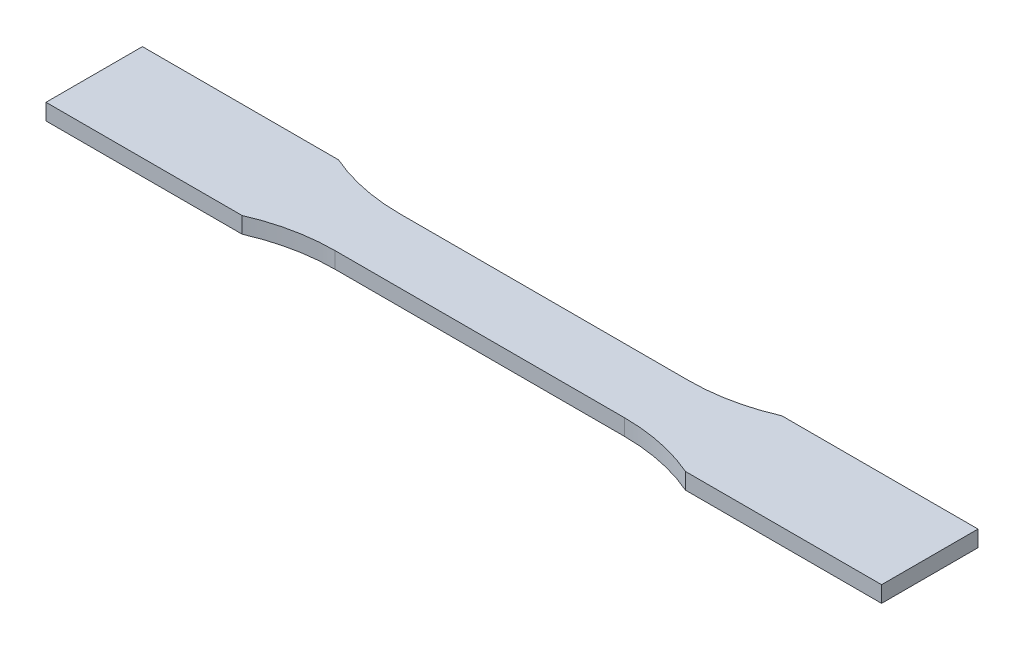
ISO-10303-21;
HEADER;
FILE_DESCRIPTION(('STEP AP214'),'2;1');
FILE_NAME('part.step','',(''),(''),'','','');
FILE_SCHEMA(('AUTOMOTIVE_DESIGN { 1 0 10303 214 1 1 1 1 }'));
ENDSEC;
DATA;
#1=APPLICATION_CONTEXT('core data for automotive mechanical design processes');
#2=APPLICATION_PROTOCOL_DEFINITION('international standard','automotive_design',2000,#1);
#3=PRODUCT_CONTEXT('',#1,'mechanical');
#4=PRODUCT('Part','Part','',(#3));
#5=PRODUCT_RELATED_PRODUCT_CATEGORY('part','',(#4));
#6=PRODUCT_DEFINITION_FORMATION('','',#4);
#7=PRODUCT_DEFINITION_CONTEXT('part definition',#1,'design');
#8=PRODUCT_DEFINITION('design','',#6,#7);
#9=PRODUCT_DEFINITION_SHAPE('','',#8);
#10=(LENGTH_UNIT() NAMED_UNIT(*) SI_UNIT(.MILLI.,.METRE.));
#11=(NAMED_UNIT(*) PLANE_ANGLE_UNIT() SI_UNIT($,.RADIAN.));
#12=(NAMED_UNIT(*) SI_UNIT($,.STERADIAN.) SOLID_ANGLE_UNIT());
#13=UNCERTAINTY_MEASURE_WITH_UNIT(LENGTH_MEASURE(1.E-05),#10,'distance_accuracy_value','');
#14=(GEOMETRIC_REPRESENTATION_CONTEXT(3) GLOBAL_UNCERTAINTY_ASSIGNED_CONTEXT((#13)) GLOBAL_UNIT_ASSIGNED_CONTEXT((#10,
#11,#12)) REPRESENTATION_CONTEXT('',''));
#15=CARTESIAN_POINT('',(0.,0.,0.));
#16=DIRECTION('',(0.,0.,1.));
#17=DIRECTION('',(1.,0.,0.));
#18=AXIS2_PLACEMENT_3D('',#15,#16,#17);
#19=CARTESIAN_POINT('',(-28.575,3.2,-44.45));
#20=DIRECTION('',(0.,-1.,0.));
#21=DIRECTION('',(0.,0.,-1.));
#22=AXIS2_PLACEMENT_3D('',#19,#20,#21);
#23=CYLINDRICAL_SURFACE('',#22,38.1);
#24=CARTESIAN_POINT('',(-28.575,0.,-44.45));
#25=DIRECTION('',(0.,1.,0.));
#26=DIRECTION('',(0.,0.,1.));
#27=AXIS2_PLACEMENT_3D('',#24,#25,#26);
#28=CIRCLE('',#27,38.1);
#29=CARTESIAN_POINT('',(-43.8017650865179,0.,-9.525));
#30=VERTEX_POINT('',#29);
#31=CARTESIAN_POINT('',(-28.575,0.,-6.35));
#32=VERTEX_POINT('',#31);
#33=EDGE_CURVE('E151',#30,#32,#28,.T.);
#34=ORIENTED_EDGE('',*,*,#33,.F.);
#35=DIRECTION('',(0.,-1.,0.));
#36=VECTOR('',#35,1.);
#37=CARTESIAN_POINT('',(-43.8017650865179,3.2,-9.525));
#38=LINE('',#37,#36);
#39=CARTESIAN_POINT('',(-43.8017650865179,3.2,-9.525));
#40=VERTEX_POINT('',#39);
#41=EDGE_CURVE('E11',#40,#30,#38,.T.);
#42=ORIENTED_EDGE('',*,*,#41,.F.);
#43=CARTESIAN_POINT('',(-28.575,3.2,-44.45));
#44=DIRECTION('',(0.,1.,0.));
#45=DIRECTION('',(0.,0.,1.));
#46=AXIS2_PLACEMENT_3D('',#43,#44,#45);
#47=CIRCLE('',#46,38.1);
#48=CARTESIAN_POINT('',(-28.575,3.2,-6.35));
#49=VERTEX_POINT('',#48);
#50=EDGE_CURVE('E182',#40,#49,#47,.T.);
#51=ORIENTED_EDGE('',*,*,#50,.T.);
#52=DIRECTION('',(0.,-1.,0.));
#53=VECTOR('',#52,1.);
#54=CARTESIAN_POINT('',(-28.575,3.2,-6.35));
#55=LINE('',#54,#53);
#56=EDGE_CURVE('E51',#49,#32,#55,.T.);
#57=ORIENTED_EDGE('',*,*,#56,.T.);
#58=EDGE_LOOP('',(#34,#42,#51,#57));
#59=FACE_BOUND('',#58,.T.);
#60=ADVANCED_FACE('F35',(#59),#23,.F.);
#61=CARTESIAN_POINT('',(0.,3.2,-9.525));
#62=DIRECTION('',(0.,0.,-1.));
#63=DIRECTION('',(-1.,0.,0.));
#64=AXIS2_PLACEMENT_3D('',#61,#62,#63);
#65=PLANE('',#64);
#66=DIRECTION('',(1.,0.,0.));
#67=VECTOR('',#66,1.);
#68=CARTESIAN_POINT('',(0.,0.,-9.525));
#69=LINE('',#68,#67);
#70=CARTESIAN_POINT('',(-82.55,0.,-9.525));
#71=VERTEX_POINT('',#70);
#72=EDGE_CURVE('E153',#71,#30,#69,.T.);
#73=ORIENTED_EDGE('',*,*,#72,.F.);
#74=DIRECTION('',(0.,-1.,0.));
#75=VECTOR('',#74,1.);
#76=CARTESIAN_POINT('',(-82.55,3.2,-9.525));
#77=LINE('',#76,#75);
#78=CARTESIAN_POINT('',(-82.55,3.2,-9.525));
#79=VERTEX_POINT('',#78);
#80=EDGE_CURVE('E43',#79,#71,#77,.T.);
#81=ORIENTED_EDGE('',*,*,#80,.F.);
#82=DIRECTION('',(1.,0.,0.));
#83=VECTOR('',#82,1.);
#84=CARTESIAN_POINT('',(0.,3.2,-9.525));
#85=LINE('',#84,#83);
#86=EDGE_CURVE('E212',#79,#40,#85,.T.);
#87=ORIENTED_EDGE('',*,*,#86,.T.);
#88=ORIENTED_EDGE('',*,*,#41,.T.);
#89=EDGE_LOOP('',(#73,#81,#87,#88));
#90=FACE_BOUND('',#89,.T.);
#91=ADVANCED_FACE('F211',(#90),#65,.T.);
#92=CARTESIAN_POINT('',(-82.55,3.2,0.));
#93=DIRECTION('',(1.,0.,0.));
#94=DIRECTION('',(0.,0.,-1.));
#95=AXIS2_PLACEMENT_3D('',#92,#93,#94);
#96=PLANE('',#95);
#97=DIRECTION('',(0.,0.,1.));
#98=VECTOR('',#97,1.);
#99=CARTESIAN_POINT('',(-82.55,0.,0.));
#100=LINE('',#99,#98);
#101=CARTESIAN_POINT('',(-82.55,0.,9.52500000000001));
#102=VERTEX_POINT('',#101);
#103=EDGE_CURVE('E156',#71,#102,#100,.T.);
#104=ORIENTED_EDGE('',*,*,#103,.T.);
#105=DIRECTION('',(0.,-1.,0.));
#106=VECTOR('',#105,1.);
#107=CARTESIAN_POINT('',(-82.55,3.2,9.52500000000001));
#108=LINE('',#107,#106);
#109=CARTESIAN_POINT('',(-82.55,3.2,9.52500000000001));
#110=VERTEX_POINT('',#109);
#111=EDGE_CURVE('E196',#110,#102,#108,.T.);
#112=ORIENTED_EDGE('',*,*,#111,.F.);
#113=DIRECTION('',(0.,0.,1.));
#114=VECTOR('',#113,1.);
#115=CARTESIAN_POINT('',(-82.55,3.2,0.));
#116=LINE('',#115,#114);
#117=EDGE_CURVE('E203',#79,#110,#116,.T.);
#118=ORIENTED_EDGE('',*,*,#117,.F.);
#119=ORIENTED_EDGE('',*,*,#80,.T.);
#120=EDGE_LOOP('',(#104,#112,#118,#119));
#121=FACE_BOUND('',#120,.T.);
#122=ADVANCED_FACE('F201',(#121),#96,.F.);
#123=CARTESIAN_POINT('',(0.,3.2,9.52500000000001));
#124=DIRECTION('',(0.,0.,-1.));
#125=DIRECTION('',(-1.,0.,0.));
#126=AXIS2_PLACEMENT_3D('',#123,#124,#125);
#127=PLANE('',#126);
#128=DIRECTION('',(1.,0.,0.));
#129=VECTOR('',#128,1.);
#130=CARTESIAN_POINT('',(0.,0.,9.52500000000001));
#131=LINE('',#130,#129);
#132=CARTESIAN_POINT('',(-43.8017650865179,0.,9.52500000000001));
#133=VERTEX_POINT('',#132);
#134=EDGE_CURVE('E158',#102,#133,#131,.T.);
#135=ORIENTED_EDGE('',*,*,#134,.T.);
#136=DIRECTION('',(0.,-1.,0.));
#137=VECTOR('',#136,1.);
#138=CARTESIAN_POINT('',(-43.8017650865179,3.2,9.52500000000001));
#139=LINE('',#138,#137);
#140=CARTESIAN_POINT('',(-43.8017650865179,3.2,9.52500000000001));
#141=VERTEX_POINT('',#140);
#142=EDGE_CURVE('E194',#141,#133,#139,.T.);
#143=ORIENTED_EDGE('',*,*,#142,.F.);
#144=DIRECTION('',(1.,0.,0.));
#145=VECTOR('',#144,1.);
#146=CARTESIAN_POINT('',(0.,3.2,9.52500000000001));
#147=LINE('',#146,#145);
#148=EDGE_CURVE('E365',#110,#141,#147,.T.);
#149=ORIENTED_EDGE('',*,*,#148,.F.);
#150=ORIENTED_EDGE('',*,*,#111,.T.);
#151=EDGE_LOOP('',(#135,#143,#149,#150));
#152=FACE_BOUND('',#151,.T.);
#153=ADVANCED_FACE('F230',(#152),#127,.F.);
#154=CARTESIAN_POINT('',(-28.575,3.2,44.45));
#155=DIRECTION('',(0.,-1.,0.));
#156=DIRECTION('',(0.,0.,-1.));
#157=AXIS2_PLACEMENT_3D('',#154,#155,#156);
#158=CYLINDRICAL_SURFACE('',#157,38.1);
#159=CARTESIAN_POINT('',(-28.575,0.,44.45));
#160=DIRECTION('',(0.,1.,0.));
#161=DIRECTION('',(0.,0.,1.));
#162=AXIS2_PLACEMENT_3D('',#159,#160,#161);
#163=CIRCLE('',#162,38.1);
#164=CARTESIAN_POINT('',(-28.575,0.,6.35));
#165=VERTEX_POINT('',#164);
#166=EDGE_CURVE('E161',#165,#133,#163,.T.);
#167=ORIENTED_EDGE('',*,*,#166,.F.);
#168=DIRECTION('',(0.,-1.,0.));
#169=VECTOR('',#168,1.);
#170=CARTESIAN_POINT('',(-28.575,3.2,6.35));
#171=LINE('',#170,#169);
#172=CARTESIAN_POINT('',(-28.575,3.2,6.35));
#173=VERTEX_POINT('',#172);
#174=EDGE_CURVE('E192',#173,#165,#171,.T.);
#175=ORIENTED_EDGE('',*,*,#174,.F.);
#176=CARTESIAN_POINT('',(-28.575,3.2,44.45));
#177=DIRECTION('',(0.,1.,0.));
#178=DIRECTION('',(0.,0.,1.));
#179=AXIS2_PLACEMENT_3D('',#176,#177,#178);
#180=CIRCLE('',#179,38.1);
#181=EDGE_CURVE('E363',#173,#141,#180,.T.);
#182=ORIENTED_EDGE('',*,*,#181,.T.);
#183=ORIENTED_EDGE('',*,*,#142,.T.);
#184=EDGE_LOOP('',(#167,#175,#182,#183));
#185=FACE_BOUND('',#184,.T.);
#186=ADVANCED_FACE('F235',(#185),#158,.F.);
#187=CARTESIAN_POINT('',(0.,3.2,6.35));
#188=DIRECTION('',(0.,0.,-1.));
#189=DIRECTION('',(-1.,0.,0.));
#190=AXIS2_PLACEMENT_3D('',#187,#188,#189);
#191=PLANE('',#190);
#192=DIRECTION('',(1.,0.,0.));
#193=VECTOR('',#192,1.);
#194=CARTESIAN_POINT('',(0.,0.,6.35));
#195=LINE('',#194,#193);
#196=CARTESIAN_POINT('',(28.575,0.,6.35));
#197=VERTEX_POINT('',#196);
#198=EDGE_CURVE('E164',#165,#197,#195,.T.);
#199=ORIENTED_EDGE('',*,*,#198,.T.);
#200=DIRECTION('',(0.,-1.,0.));
#201=VECTOR('',#200,1.);
#202=CARTESIAN_POINT('',(28.575,3.2,6.35));
#203=LINE('',#202,#201);
#204=CARTESIAN_POINT('',(28.575,3.2,6.35));
#205=VERTEX_POINT('',#204);
#206=EDGE_CURVE('E190',#205,#197,#203,.T.);
#207=ORIENTED_EDGE('',*,*,#206,.F.);
#208=DIRECTION('',(1.,0.,0.));
#209=VECTOR('',#208,1.);
#210=CARTESIAN_POINT('',(0.,3.2,6.35));
#211=LINE('',#210,#209);
#212=EDGE_CURVE('E367',#173,#205,#211,.T.);
#213=ORIENTED_EDGE('',*,*,#212,.F.);
#214=ORIENTED_EDGE('',*,*,#174,.T.);
#215=EDGE_LOOP('',(#199,#207,#213,#214));
#216=FACE_BOUND('',#215,.T.);
#217=ADVANCED_FACE('F239',(#216),#191,.F.);
#218=CARTESIAN_POINT('',(28.575,3.2,44.45));
#219=DIRECTION('',(0.,-1.,0.));
#220=DIRECTION('',(0.,0.,-1.));
#221=AXIS2_PLACEMENT_3D('',#218,#219,#220);
#222=CYLINDRICAL_SURFACE('',#221,38.1);
#223=CARTESIAN_POINT('',(28.575,0.,44.45));
#224=DIRECTION('',(0.,1.,0.));
#225=DIRECTION('',(0.,0.,1.));
#226=AXIS2_PLACEMENT_3D('',#223,#224,#225);
#227=CIRCLE('',#226,38.1);
#228=CARTESIAN_POINT('',(43.8017650865179,0.,9.52500000000001));
#229=VERTEX_POINT('',#228);
#230=EDGE_CURVE('E167',#229,#197,#227,.T.);
#231=ORIENTED_EDGE('',*,*,#230,.F.);
#232=DIRECTION('',(0.,-1.,0.));
#233=VECTOR('',#232,1.);
#234=CARTESIAN_POINT('',(43.8017650865179,3.2,9.52500000000001));
#235=LINE('',#234,#233);
#236=CARTESIAN_POINT('',(43.8017650865179,3.2,9.52500000000001));
#237=VERTEX_POINT('',#236);
#238=EDGE_CURVE('E188',#237,#229,#235,.T.);
#239=ORIENTED_EDGE('',*,*,#238,.F.);
#240=CARTESIAN_POINT('',(28.575,3.2,44.45));
#241=DIRECTION('',(0.,1.,0.));
#242=DIRECTION('',(0.,0.,1.));
#243=AXIS2_PLACEMENT_3D('',#240,#241,#242);
#244=CIRCLE('',#243,38.1);
#245=EDGE_CURVE('E357',#237,#205,#244,.T.);
#246=ORIENTED_EDGE('',*,*,#245,.T.);
#247=ORIENTED_EDGE('',*,*,#206,.T.);
#248=EDGE_LOOP('',(#231,#239,#246,#247));
#249=FACE_BOUND('',#248,.T.);
#250=ADVANCED_FACE('F243',(#249),#222,.F.);
#251=CARTESIAN_POINT('',(0.,3.2,9.52500000000001));
#252=DIRECTION('',(0.,0.,-1.));
#253=DIRECTION('',(-1.,0.,0.));
#254=AXIS2_PLACEMENT_3D('',#251,#252,#253);
#255=PLANE('',#254);
#256=DIRECTION('',(1.,0.,0.));
#257=VECTOR('',#256,1.);
#258=CARTESIAN_POINT('',(0.,0.,9.52500000000001));
#259=LINE('',#258,#257);
#260=CARTESIAN_POINT('',(82.55,0.,9.52500000000001));
#261=VERTEX_POINT('',#260);
#262=EDGE_CURVE('E170',#229,#261,#259,.T.);
#263=ORIENTED_EDGE('',*,*,#262,.T.);
#264=DIRECTION('',(0.,-1.,0.));
#265=VECTOR('',#264,1.);
#266=CARTESIAN_POINT('',(82.55,3.2,9.52500000000001));
#267=LINE('',#266,#265);
#268=CARTESIAN_POINT('',(82.55,3.2,9.52500000000001));
#269=VERTEX_POINT('',#268);
#270=EDGE_CURVE('E186',#269,#261,#267,.T.);
#271=ORIENTED_EDGE('',*,*,#270,.F.);
#272=DIRECTION('',(1.,0.,0.));
#273=VECTOR('',#272,1.);
#274=CARTESIAN_POINT('',(0.,3.2,9.52500000000001));
#275=LINE('',#274,#273);
#276=EDGE_CURVE('E374',#237,#269,#275,.T.);
#277=ORIENTED_EDGE('',*,*,#276,.F.);
#278=ORIENTED_EDGE('',*,*,#238,.T.);
#279=EDGE_LOOP('',(#263,#271,#277,#278));
#280=FACE_BOUND('',#279,.T.);
#281=ADVANCED_FACE('F247',(#280),#255,.F.);
#282=CARTESIAN_POINT('',(82.55,3.2,0.));
#283=DIRECTION('',(1.,0.,0.));
#284=DIRECTION('',(0.,0.,-1.));
#285=AXIS2_PLACEMENT_3D('',#282,#283,#284);
#286=PLANE('',#285);
#287=DIRECTION('',(0.,0.,1.));
#288=VECTOR('',#287,1.);
#289=CARTESIAN_POINT('',(82.55,0.,0.));
#290=LINE('',#289,#288);
#291=CARTESIAN_POINT('',(82.55,0.,-9.525));
#292=VERTEX_POINT('',#291);
#293=EDGE_CURVE('E173',#292,#261,#290,.T.);
#294=ORIENTED_EDGE('',*,*,#293,.F.);
#295=DIRECTION('',(0.,-1.,0.));
#296=VECTOR('',#295,1.);
#297=CARTESIAN_POINT('',(82.55,3.2,-9.525));
#298=LINE('',#297,#296);
#299=CARTESIAN_POINT('',(82.55,3.2,-9.525));
#300=VERTEX_POINT('',#299);
#301=EDGE_CURVE('E134',#300,#292,#298,.T.);
#302=ORIENTED_EDGE('',*,*,#301,.F.);
#303=DIRECTION('',(0.,0.,1.));
#304=VECTOR('',#303,1.);
#305=CARTESIAN_POINT('',(82.55,3.2,0.));
#306=LINE('',#305,#304);
#307=EDGE_CURVE('E143',#300,#269,#306,.T.);
#308=ORIENTED_EDGE('',*,*,#307,.T.);
#309=ORIENTED_EDGE('',*,*,#270,.T.);
#310=EDGE_LOOP('',(#294,#302,#308,#309));
#311=FACE_BOUND('',#310,.T.);
#312=ADVANCED_FACE('F251',(#311),#286,.T.);
#313=CARTESIAN_POINT('',(0.,3.2,-9.525));
#314=DIRECTION('',(0.,0.,-1.));
#315=DIRECTION('',(-1.,0.,0.));
#316=AXIS2_PLACEMENT_3D('',#313,#314,#315);
#317=PLANE('',#316);
#318=DIRECTION('',(1.,0.,0.));
#319=VECTOR('',#318,1.);
#320=CARTESIAN_POINT('',(0.,0.,-9.525));
#321=LINE('',#320,#319);
#322=CARTESIAN_POINT('',(43.8017650865179,0.,-9.52499999999999));
#323=VERTEX_POINT('',#322);
#324=EDGE_CURVE('E130',#323,#292,#321,.T.);
#325=ORIENTED_EDGE('',*,*,#324,.F.);
#326=DIRECTION('',(0.,-1.,0.));
#327=VECTOR('',#326,1.);
#328=CARTESIAN_POINT('',(43.8017650865179,3.2,-9.52499999999999));
#329=LINE('',#328,#327);
#330=CARTESIAN_POINT('',(43.8017650865179,3.2,-9.52499999999999));
#331=VERTEX_POINT('',#330);
#332=EDGE_CURVE('E125',#331,#323,#329,.T.);
#333=ORIENTED_EDGE('',*,*,#332,.F.);
#334=DIRECTION('',(1.,0.,0.));
#335=VECTOR('',#334,1.);
#336=CARTESIAN_POINT('',(0.,3.2,-9.525));
#337=LINE('',#336,#335);
#338=EDGE_CURVE('E128',#331,#300,#337,.T.);
#339=ORIENTED_EDGE('',*,*,#338,.T.);
#340=ORIENTED_EDGE('',*,*,#301,.T.);
#341=EDGE_LOOP('',(#325,#333,#339,#340));
#342=FACE_BOUND('',#341,.T.);
#343=ADVANCED_FACE('F127',(#342),#317,.T.);
#344=CARTESIAN_POINT('',(28.575,3.2,-44.45));
#345=DIRECTION('',(0.,-1.,0.));
#346=DIRECTION('',(0.,0.,-1.));
#347=AXIS2_PLACEMENT_3D('',#344,#345,#346);
#348=CYLINDRICAL_SURFACE('',#347,38.1);
#349=CARTESIAN_POINT('',(28.575,0.,-44.45));
#350=DIRECTION('',(0.,1.,0.));
#351=DIRECTION('',(0.,0.,1.));
#352=AXIS2_PLACEMENT_3D('',#349,#350,#351);
#353=CIRCLE('',#352,38.1);
#354=CARTESIAN_POINT('',(28.575,0.,-6.35));
#355=VERTEX_POINT('',#354);
#356=EDGE_CURVE('E177',#355,#323,#353,.T.);
#357=ORIENTED_EDGE('',*,*,#356,.F.);
#358=DIRECTION('',(0.,-1.,0.));
#359=VECTOR('',#358,1.);
#360=CARTESIAN_POINT('',(28.575,3.2,-6.35));
#361=LINE('',#360,#359);
#362=CARTESIAN_POINT('',(28.575,3.2,-6.35));
#363=VERTEX_POINT('',#362);
#364=EDGE_CURVE('E88',#363,#355,#361,.T.);
#365=ORIENTED_EDGE('',*,*,#364,.F.);
#366=CARTESIAN_POINT('',(28.575,3.2,-44.45));
#367=DIRECTION('',(0.,1.,0.));
#368=DIRECTION('',(0.,0.,1.));
#369=AXIS2_PLACEMENT_3D('',#366,#367,#368);
#370=CIRCLE('',#369,38.1);
#371=EDGE_CURVE('E141',#363,#331,#370,.T.);
#372=ORIENTED_EDGE('',*,*,#371,.T.);
#373=ORIENTED_EDGE('',*,*,#332,.T.);
#374=EDGE_LOOP('',(#357,#365,#372,#373));
#375=FACE_BOUND('',#374,.T.);
#376=ADVANCED_FACE('F145',(#375),#348,.F.);
#377=CARTESIAN_POINT('',(0.,3.2,-6.35));
#378=DIRECTION('',(0.,0.,-1.));
#379=DIRECTION('',(-1.,0.,0.));
#380=AXIS2_PLACEMENT_3D('',#377,#378,#379);
#381=PLANE('',#380);
#382=DIRECTION('',(1.,0.,0.));
#383=VECTOR('',#382,1.);
#384=CARTESIAN_POINT('',(0.,0.,-6.35));
#385=LINE('',#384,#383);
#386=EDGE_CURVE('E179',#32,#355,#385,.T.);
#387=ORIENTED_EDGE('',*,*,#386,.F.);
#388=ORIENTED_EDGE('',*,*,#56,.F.);
#389=DIRECTION('',(1.,0.,0.));
#390=VECTOR('',#389,1.);
#391=CARTESIAN_POINT('',(0.,3.2,-6.35));
#392=LINE('',#391,#390);
#393=EDGE_CURVE('E146',#49,#363,#392,.T.);
#394=ORIENTED_EDGE('',*,*,#393,.T.);
#395=ORIENTED_EDGE('',*,*,#364,.T.);
#396=EDGE_LOOP('',(#387,#388,#394,#395));
#397=FACE_BOUND('',#396,.T.);
#398=ADVANCED_FACE('F213',(#397),#381,.T.);
#399=CARTESIAN_POINT('',(0.,3.2,0.));
#400=DIRECTION('',(0.,1.,0.));
#401=DIRECTION('',(0.,0.,1.));
#402=AXIS2_PLACEMENT_3D('',#399,#400,#401);
#403=PLANE('',#402);
#404=ORIENTED_EDGE('',*,*,#50,.F.);
#405=ORIENTED_EDGE('',*,*,#86,.F.);
#406=ORIENTED_EDGE('',*,*,#117,.T.);
#407=ORIENTED_EDGE('',*,*,#148,.T.);
#408=ORIENTED_EDGE('',*,*,#181,.F.);
#409=ORIENTED_EDGE('',*,*,#212,.T.);
#410=ORIENTED_EDGE('',*,*,#245,.F.);
#411=ORIENTED_EDGE('',*,*,#276,.T.);
#412=ORIENTED_EDGE('',*,*,#307,.F.);
#413=ORIENTED_EDGE('',*,*,#338,.F.);
#414=ORIENTED_EDGE('',*,*,#371,.F.);
#415=ORIENTED_EDGE('',*,*,#393,.F.);
#416=EDGE_LOOP('',(#404,#405,#406,#407,#408,#409,#410,#411,#412,#413,#414,#415));
#417=FACE_BOUND('',#416,.T.);
#418=ADVANCED_FACE('F139',(#417),#403,.T.);
#419=CARTESIAN_POINT('',(0.,0.,0.));
#420=DIRECTION('',(0.,1.,0.));
#421=DIRECTION('',(0.,0.,1.));
#422=AXIS2_PLACEMENT_3D('',#419,#420,#421);
#423=PLANE('',#422);
#424=ORIENTED_EDGE('',*,*,#33,.T.);
#425=ORIENTED_EDGE('',*,*,#386,.T.);
#426=ORIENTED_EDGE('',*,*,#356,.T.);
#427=ORIENTED_EDGE('',*,*,#324,.T.);
#428=ORIENTED_EDGE('',*,*,#293,.T.);
#429=ORIENTED_EDGE('',*,*,#262,.F.);
#430=ORIENTED_EDGE('',*,*,#230,.T.);
#431=ORIENTED_EDGE('',*,*,#198,.F.);
#432=ORIENTED_EDGE('',*,*,#166,.T.);
#433=ORIENTED_EDGE('',*,*,#134,.F.);
#434=ORIENTED_EDGE('',*,*,#103,.F.);
#435=ORIENTED_EDGE('',*,*,#72,.T.);
#436=EDGE_LOOP('',(#424,#425,#426,#427,#428,#429,#430,#431,#432,#433,#434,#435));
#437=FACE_BOUND('',#436,.T.);
#438=ADVANCED_FACE('F210',(#437),#423,.F.);
#439=CLOSED_SHELL('',(#60,#91,#122,#153,#186,#217,#250,#281,#312,#343,#376,#398,#418,#438));
#440=MANIFOLD_SOLID_BREP('B2',#439);
#441=ADVANCED_BREP_SHAPE_REPRESENTATION('',(#18,#440),#14);
#442=SHAPE_DEFINITION_REPRESENTATION(#9,#441);
ENDSEC;
END-ISO-10303-21;
